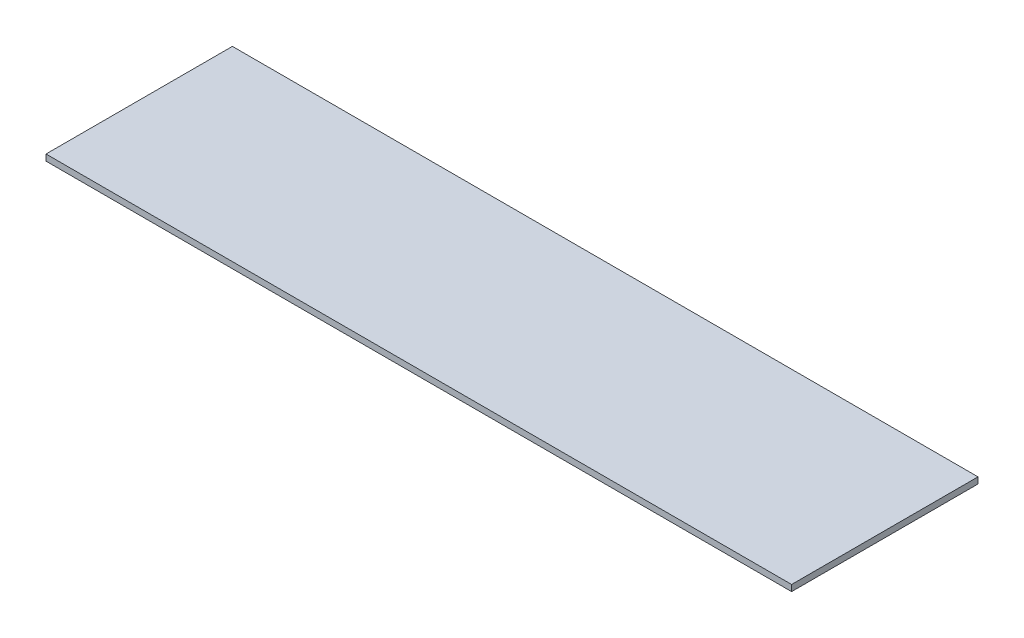
ISO-10303-21;
HEADER;
FILE_DESCRIPTION(('STEP AP214'),'2;1');
FILE_NAME('part.step','',(''),(''),'','','');
FILE_SCHEMA(('AUTOMOTIVE_DESIGN { 1 0 10303 214 1 1 1 1 }'));
ENDSEC;
DATA;
#1=APPLICATION_CONTEXT('core data for automotive mechanical design processes');
#2=APPLICATION_PROTOCOL_DEFINITION('international standard','automotive_design',2000,#1);
#3=PRODUCT_CONTEXT('',#1,'mechanical');
#4=PRODUCT('Part','Part','',(#3));
#5=PRODUCT_RELATED_PRODUCT_CATEGORY('part','',(#4));
#6=PRODUCT_DEFINITION_FORMATION('','',#4);
#7=PRODUCT_DEFINITION_CONTEXT('part definition',#1,'design');
#8=PRODUCT_DEFINITION('design','',#6,#7);
#9=PRODUCT_DEFINITION_SHAPE('','',#8);
#10=(LENGTH_UNIT() NAMED_UNIT(*) SI_UNIT(.MILLI.,.METRE.));
#11=(NAMED_UNIT(*) PLANE_ANGLE_UNIT() SI_UNIT($,.RADIAN.));
#12=(NAMED_UNIT(*) SI_UNIT($,.STERADIAN.) SOLID_ANGLE_UNIT());
#13=UNCERTAINTY_MEASURE_WITH_UNIT(LENGTH_MEASURE(1.E-05),#10,'distance_accuracy_value','');
#14=(GEOMETRIC_REPRESENTATION_CONTEXT(3) GLOBAL_UNCERTAINTY_ASSIGNED_CONTEXT((#13)) GLOBAL_UNIT_ASSIGNED_CONTEXT((#10,
#11,#12)) REPRESENTATION_CONTEXT('',''));
#15=CARTESIAN_POINT('',(0.,0.,0.));
#16=DIRECTION('',(0.,0.,1.));
#17=DIRECTION('',(1.,0.,0.));
#18=AXIS2_PLACEMENT_3D('',#15,#16,#17);
#19=CARTESIAN_POINT('',(-300.,5.,75.));
#20=DIRECTION('',(1.,0.,0.));
#21=DIRECTION('',(0.,0.,-1.));
#22=AXIS2_PLACEMENT_3D('',#19,#20,#21);
#23=PLANE('',#22);
#24=DIRECTION('',(0.,0.,1.));
#25=VECTOR('',#24,1.);
#26=CARTESIAN_POINT('',(-300.,0.,75.));
#27=LINE('',#26,#25);
#28=CARTESIAN_POINT('',(-300.,0.,-75.));
#29=VERTEX_POINT('',#28);
#30=CARTESIAN_POINT('',(-300.,0.,75.));
#31=VERTEX_POINT('',#30);
#32=EDGE_CURVE('E107',#29,#31,#27,.T.);
#33=ORIENTED_EDGE('',*,*,#32,.T.);
#34=DIRECTION('',(0.,-1.,0.));
#35=VECTOR('',#34,1.);
#36=CARTESIAN_POINT('',(-300.,5.,75.));
#37=LINE('',#36,#35);
#38=CARTESIAN_POINT('',(-300.,5.,75.));
#39=VERTEX_POINT('',#38);
#40=EDGE_CURVE('E11',#39,#31,#37,.T.);
#41=ORIENTED_EDGE('',*,*,#40,.F.);
#42=DIRECTION('',(0.,0.,1.));
#43=VECTOR('',#42,1.);
#44=CARTESIAN_POINT('',(-300.,5.,75.));
#45=LINE('',#44,#43);
#46=CARTESIAN_POINT('',(-300.,5.,-75.));
#47=VERTEX_POINT('',#46);
#48=EDGE_CURVE('E91',#47,#39,#45,.T.);
#49=ORIENTED_EDGE('',*,*,#48,.F.);
#50=DIRECTION('',(0.,-1.,0.));
#51=VECTOR('',#50,1.);
#52=CARTESIAN_POINT('',(-300.,5.,-75.));
#53=LINE('',#52,#51);
#54=EDGE_CURVE('E103',#47,#29,#53,.T.);
#55=ORIENTED_EDGE('',*,*,#54,.T.);
#56=EDGE_LOOP('',(#33,#41,#49,#55));
#57=FACE_BOUND('',#56,.T.);
#58=ADVANCED_FACE('F39',(#57),#23,.F.);
#59=CARTESIAN_POINT('',(300.,5.,74.9999999999999));
#60=DIRECTION('',(0.,0.,-1.));
#61=DIRECTION('',(-1.,0.,0.));
#62=AXIS2_PLACEMENT_3D('',#59,#60,#61);
#63=PLANE('',#62);
#64=DIRECTION('',(1.,0.,0.));
#65=VECTOR('',#64,1.);
#66=CARTESIAN_POINT('',(300.,0.,74.9999999999999));
#67=LINE('',#66,#65);
#68=CARTESIAN_POINT('',(300.,0.,74.9999999999999));
#69=VERTEX_POINT('',#68);
#70=EDGE_CURVE('E96',#31,#69,#67,.T.);
#71=ORIENTED_EDGE('',*,*,#70,.T.);
#72=DIRECTION('',(0.,-1.,0.));
#73=VECTOR('',#72,1.);
#74=CARTESIAN_POINT('',(300.,5.,74.9999999999999));
#75=LINE('',#74,#73);
#76=CARTESIAN_POINT('',(300.,5.,74.9999999999999));
#77=VERTEX_POINT('',#76);
#78=EDGE_CURVE('E48',#77,#69,#75,.T.);
#79=ORIENTED_EDGE('',*,*,#78,.F.);
#80=DIRECTION('',(1.,0.,0.));
#81=VECTOR('',#80,1.);
#82=CARTESIAN_POINT('',(300.,5.,74.9999999999999));
#83=LINE('',#82,#81);
#84=EDGE_CURVE('E86',#39,#77,#83,.T.);
#85=ORIENTED_EDGE('',*,*,#84,.F.);
#86=ORIENTED_EDGE('',*,*,#40,.T.);
#87=EDGE_LOOP('',(#71,#79,#85,#86));
#88=FACE_BOUND('',#87,.T.);
#89=ADVANCED_FACE('F95',(#88),#63,.F.);
#90=CARTESIAN_POINT('',(300.,5.,74.9999999999999));
#91=DIRECTION('',(-1.,0.,0.));
#92=DIRECTION('',(0.,0.,1.));
#93=AXIS2_PLACEMENT_3D('',#90,#91,#92);
#94=PLANE('',#93);
#95=DIRECTION('',(0.,0.,-1.));
#96=VECTOR('',#95,1.);
#97=CARTESIAN_POINT('',(300.,0.,74.9999999999999));
#98=LINE('',#97,#96);
#99=CARTESIAN_POINT('',(300.,0.,-75.));
#100=VERTEX_POINT('',#99);
#101=EDGE_CURVE('E73',#69,#100,#98,.T.);
#102=ORIENTED_EDGE('',*,*,#101,.T.);
#103=DIRECTION('',(0.,-1.,0.));
#104=VECTOR('',#103,1.);
#105=CARTESIAN_POINT('',(300.,5.,-75.));
#106=LINE('',#105,#104);
#107=CARTESIAN_POINT('',(300.,5.,-75.));
#108=VERTEX_POINT('',#107);
#109=EDGE_CURVE('E98',#108,#100,#106,.T.);
#110=ORIENTED_EDGE('',*,*,#109,.F.);
#111=DIRECTION('',(0.,0.,-1.));
#112=VECTOR('',#111,1.);
#113=CARTESIAN_POINT('',(300.,5.,74.9999999999999));
#114=LINE('',#113,#112);
#115=EDGE_CURVE('E89',#77,#108,#114,.T.);
#116=ORIENTED_EDGE('',*,*,#115,.F.);
#117=ORIENTED_EDGE('',*,*,#78,.T.);
#118=EDGE_LOOP('',(#102,#110,#116,#117));
#119=FACE_BOUND('',#118,.T.);
#120=ADVANCED_FACE('F99',(#119),#94,.F.);
#121=CARTESIAN_POINT('',(300.,5.,-75.));
#122=DIRECTION('',(0.,0.,1.));
#123=DIRECTION('',(1.,0.,0.));
#124=AXIS2_PLACEMENT_3D('',#121,#122,#123);
#125=PLANE('',#124);
#126=DIRECTION('',(-1.,0.,0.));
#127=VECTOR('',#126,1.);
#128=CARTESIAN_POINT('',(300.,0.,-75.));
#129=LINE('',#128,#127);
#130=EDGE_CURVE('E79',#100,#29,#129,.T.);
#131=ORIENTED_EDGE('',*,*,#130,.T.);
#132=ORIENTED_EDGE('',*,*,#54,.F.);
#133=DIRECTION('',(-1.,0.,0.));
#134=VECTOR('',#133,1.);
#135=CARTESIAN_POINT('',(300.,5.,-75.));
#136=LINE('',#135,#134);
#137=EDGE_CURVE('E56',#108,#47,#136,.T.);
#138=ORIENTED_EDGE('',*,*,#137,.F.);
#139=ORIENTED_EDGE('',*,*,#109,.T.);
#140=EDGE_LOOP('',(#131,#132,#138,#139));
#141=FACE_BOUND('',#140,.T.);
#142=ADVANCED_FACE('F120',(#141),#125,.F.);
#143=CARTESIAN_POINT('',(0.,5.,0.));
#144=DIRECTION('',(0.,1.,0.));
#145=DIRECTION('',(0.,0.,1.));
#146=AXIS2_PLACEMENT_3D('',#143,#144,#145);
#147=PLANE('',#146);
#148=ORIENTED_EDGE('',*,*,#48,.T.);
#149=ORIENTED_EDGE('',*,*,#84,.T.);
#150=ORIENTED_EDGE('',*,*,#115,.T.);
#151=ORIENTED_EDGE('',*,*,#137,.T.);
#152=EDGE_LOOP('',(#148,#149,#150,#151));
#153=FACE_BOUND('',#152,.T.);
#154=ADVANCED_FACE('F87',(#153),#147,.T.);
#155=CARTESIAN_POINT('',(0.,0.,0.));
#156=DIRECTION('',(0.,1.,0.));
#157=DIRECTION('',(0.,0.,1.));
#158=AXIS2_PLACEMENT_3D('',#155,#156,#157);
#159=PLANE('',#158);
#160=ORIENTED_EDGE('',*,*,#32,.F.);
#161=ORIENTED_EDGE('',*,*,#130,.F.);
#162=ORIENTED_EDGE('',*,*,#101,.F.);
#163=ORIENTED_EDGE('',*,*,#70,.F.);
#164=EDGE_LOOP('',(#160,#161,#162,#163));
#165=FACE_BOUND('',#164,.T.);
#166=ADVANCED_FACE('F123',(#165),#159,.F.);
#167=CLOSED_SHELL('',(#58,#89,#120,#142,#154,#166));
#168=MANIFOLD_SOLID_BREP('B2',#167);
#169=ADVANCED_BREP_SHAPE_REPRESENTATION('',(#18,#168),#14);
#170=SHAPE_DEFINITION_REPRESENTATION(#9,#169);
ENDSEC;
END-ISO-10303-21;
